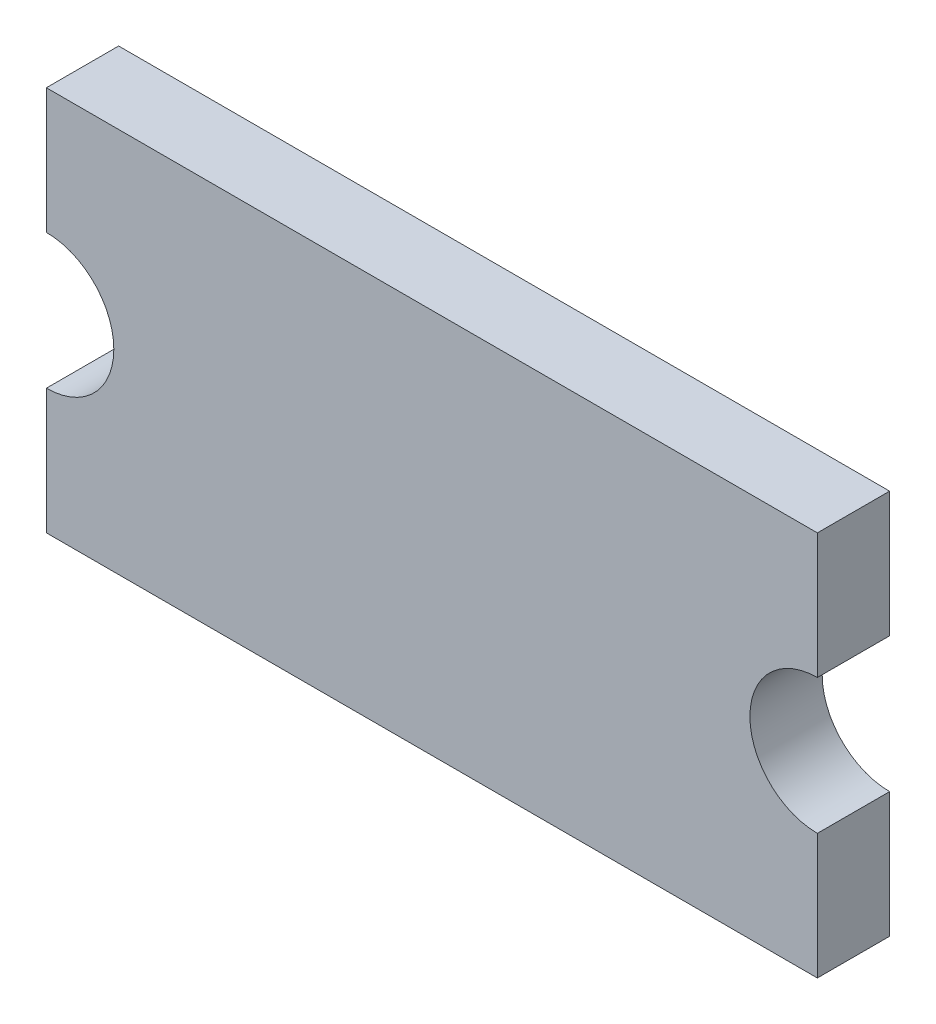
ISO-10303-21;
HEADER;
FILE_DESCRIPTION(('STEP AP214'),'2;1');
FILE_NAME('part.step','',(''),(''),'','','');
FILE_SCHEMA(('AUTOMOTIVE_DESIGN { 1 0 10303 214 1 1 1 1 }'));
ENDSEC;
DATA;
#1=APPLICATION_CONTEXT('core data for automotive mechanical design processes');
#2=APPLICATION_PROTOCOL_DEFINITION('international standard','automotive_design',2000,#1);
#3=PRODUCT_CONTEXT('',#1,'mechanical');
#4=PRODUCT('Part','Part','',(#3));
#5=PRODUCT_RELATED_PRODUCT_CATEGORY('part','',(#4));
#6=PRODUCT_DEFINITION_FORMATION('','',#4);
#7=PRODUCT_DEFINITION_CONTEXT('part definition',#1,'design');
#8=PRODUCT_DEFINITION('design','',#6,#7);
#9=PRODUCT_DEFINITION_SHAPE('','',#8);
#10=(LENGTH_UNIT() NAMED_UNIT(*) SI_UNIT(.MILLI.,.METRE.));
#11=(NAMED_UNIT(*) PLANE_ANGLE_UNIT() SI_UNIT($,.RADIAN.));
#12=(NAMED_UNIT(*) SI_UNIT($,.STERADIAN.) SOLID_ANGLE_UNIT());
#13=UNCERTAINTY_MEASURE_WITH_UNIT(LENGTH_MEASURE(1.E-05),#10,'distance_accuracy_value','');
#14=(GEOMETRIC_REPRESENTATION_CONTEXT(3) GLOBAL_UNCERTAINTY_ASSIGNED_CONTEXT((#13)) GLOBAL_UNIT_ASSIGNED_CONTEXT((#10,
#11,#12)) REPRESENTATION_CONTEXT('',''));
#15=CARTESIAN_POINT('',(0.,0.,0.));
#16=DIRECTION('',(0.,0.,1.));
#17=DIRECTION('',(1.,0.,0.));
#18=AXIS2_PLACEMENT_3D('',#15,#16,#17);
#19=CARTESIAN_POINT('',(0.,0.,0.015));
#20=DIRECTION('',(0.,0.,1.));
#21=DIRECTION('',(1.,0.,0.));
#22=AXIS2_PLACEMENT_3D('',#19,#20,#21);
#23=PLANE('',#22);
#24=DIRECTION('',(1.,0.,0.));
#25=VECTOR('',#24,1.);
#26=CARTESIAN_POINT('',(-0.4,-0.4,0.015));
#27=LINE('',#26,#25);
#28=CARTESIAN_POINT('',(-0.8,-0.4,0.015));
#29=VERTEX_POINT('',#28);
#30=CARTESIAN_POINT('',(0.8,-0.4,0.015));
#31=VERTEX_POINT('',#30);
#32=EDGE_CURVE('E27',#29,#31,#27,.T.);
#33=ORIENTED_EDGE('',*,*,#32,.F.);
#34=DIRECTION('',(0.,-1.,0.));
#35=VECTOR('',#34,1.);
#36=CARTESIAN_POINT('',(-0.8,-0.07,0.015));
#37=LINE('',#36,#35);
#38=CARTESIAN_POINT('',(-0.8,-0.14,0.015));
#39=VERTEX_POINT('',#38);
#40=EDGE_CURVE('E226',#39,#29,#37,.T.);
#41=ORIENTED_EDGE('',*,*,#40,.F.);
#42=CARTESIAN_POINT('',(-0.8,0.,0.015));
#43=DIRECTION('',(0.,0.,-1.));
#44=DIRECTION('',(0.,1.,0.));
#45=AXIS2_PLACEMENT_3D('',#42,#43,#44);
#46=CIRCLE('',#45,0.14);
#47=CARTESIAN_POINT('',(-0.8,0.14,0.015));
#48=VERTEX_POINT('',#47);
#49=EDGE_CURVE('E177',#48,#39,#46,.T.);
#50=ORIENTED_EDGE('',*,*,#49,.F.);
#51=DIRECTION('',(0.,-1.,0.));
#52=VECTOR('',#51,1.);
#53=CARTESIAN_POINT('',(-0.8,0.2,0.015));
#54=LINE('',#53,#52);
#55=CARTESIAN_POINT('',(-0.8,0.4,0.015));
#56=VERTEX_POINT('',#55);
#57=EDGE_CURVE('E165',#56,#48,#54,.T.);
#58=ORIENTED_EDGE('',*,*,#57,.F.);
#59=DIRECTION('',(-1.,0.,0.));
#60=VECTOR('',#59,1.);
#61=CARTESIAN_POINT('',(0.4,0.4,0.015));
#62=LINE('',#61,#60);
#63=CARTESIAN_POINT('',(0.8,0.4,0.015));
#64=VERTEX_POINT('',#63);
#65=EDGE_CURVE('E145',#64,#56,#62,.T.);
#66=ORIENTED_EDGE('',*,*,#65,.F.);
#67=DIRECTION('',(0.,1.,0.));
#68=VECTOR('',#67,1.);
#69=CARTESIAN_POINT('',(0.8,0.07,0.015));
#70=LINE('',#69,#68);
#71=CARTESIAN_POINT('',(0.8,0.14,0.015));
#72=VERTEX_POINT('',#71);
#73=EDGE_CURVE('E126',#72,#64,#70,.T.);
#74=ORIENTED_EDGE('',*,*,#73,.F.);
#75=CARTESIAN_POINT('',(0.8,0.,0.015));
#76=DIRECTION('',(0.,0.,-1.));
#77=DIRECTION('',(0.107142857026025,-0.994243636232237,0.));
#78=AXIS2_PLACEMENT_3D('',#75,#76,#77);
#79=CIRCLE('',#78,0.14);
#80=CARTESIAN_POINT('',(0.8,-0.14,0.015));
#81=VERTEX_POINT('',#80);
#82=EDGE_CURVE('E99',#81,#72,#79,.T.);
#83=ORIENTED_EDGE('',*,*,#82,.F.);
#84=DIRECTION('',(0.,1.,0.));
#85=VECTOR('',#84,1.);
#86=CARTESIAN_POINT('',(0.8,-0.2,0.015));
#87=LINE('',#86,#85);
#88=EDGE_CURVE('E76',#31,#81,#87,.T.);
#89=ORIENTED_EDGE('',*,*,#88,.F.);
#90=EDGE_LOOP('',(#33,#41,#50,#58,#66,#74,#83,#89));
#91=FACE_BOUND('',#90,.T.);
#92=ADVANCED_FACE('F17',(#91),#23,.F.);
#93=CARTESIAN_POINT('',(0.,0.,0.165));
#94=DIRECTION('',(0.,0.,1.));
#95=DIRECTION('',(1.,0.,0.));
#96=AXIS2_PLACEMENT_3D('',#93,#94,#95);
#97=PLANE('',#96);
#98=DIRECTION('',(1.,0.,0.));
#99=VECTOR('',#98,1.);
#100=CARTESIAN_POINT('',(-0.785000000016,-0.4,0.165));
#101=LINE('',#100,#99);
#102=CARTESIAN_POINT('',(-0.8,-0.4,0.165));
#103=VERTEX_POINT('',#102);
#104=CARTESIAN_POINT('',(0.8,-0.4,0.165));
#105=VERTEX_POINT('',#104);
#106=EDGE_CURVE('E11',#103,#105,#101,.T.);
#107=ORIENTED_EDGE('',*,*,#106,.T.);
#108=DIRECTION('',(0.,1.,0.));
#109=VECTOR('',#108,1.);
#110=CARTESIAN_POINT('',(0.8,-0.4,0.165));
#111=LINE('',#110,#109);
#112=CARTESIAN_POINT('',(0.8,-0.14,0.165));
#113=VERTEX_POINT('',#112);
#114=EDGE_CURVE('E81',#105,#113,#111,.T.);
#115=ORIENTED_EDGE('',*,*,#114,.T.);
#116=CARTESIAN_POINT('',(0.8,0.,0.165));
#117=DIRECTION('',(0.,0.,-1.));
#118=DIRECTION('',(0.107142857026025,-0.994243636232237,0.));
#119=AXIS2_PLACEMENT_3D('',#116,#117,#118);
#120=CIRCLE('',#119,0.14);
#121=CARTESIAN_POINT('',(0.8,0.14,0.165));
#122=VERTEX_POINT('',#121);
#123=EDGE_CURVE('E84',#113,#122,#120,.T.);
#124=ORIENTED_EDGE('',*,*,#123,.T.);
#125=DIRECTION('',(0.,1.,0.));
#126=VECTOR('',#125,1.);
#127=CARTESIAN_POINT('',(0.8,0.14,0.165));
#128=LINE('',#127,#126);
#129=CARTESIAN_POINT('',(0.8,0.4,0.165));
#130=VERTEX_POINT('',#129);
#131=EDGE_CURVE('E131',#122,#130,#128,.T.);
#132=ORIENTED_EDGE('',*,*,#131,.T.);
#133=DIRECTION('',(-1.,0.,0.));
#134=VECTOR('',#133,1.);
#135=CARTESIAN_POINT('',(0.785000000016,0.4,0.165));
#136=LINE('',#135,#134);
#137=CARTESIAN_POINT('',(-0.8,0.4,0.165));
#138=VERTEX_POINT('',#137);
#139=EDGE_CURVE('E149',#130,#138,#136,.T.);
#140=ORIENTED_EDGE('',*,*,#139,.T.);
#141=DIRECTION('',(0.,-1.,0.));
#142=VECTOR('',#141,1.);
#143=CARTESIAN_POINT('',(-0.8,0.4,0.165));
#144=LINE('',#143,#142);
#145=CARTESIAN_POINT('',(-0.8,0.14,0.165));
#146=VERTEX_POINT('',#145);
#147=EDGE_CURVE('E139',#138,#146,#144,.T.);
#148=ORIENTED_EDGE('',*,*,#147,.T.);
#149=CARTESIAN_POINT('',(-0.8,0.,0.165));
#150=DIRECTION('',(0.,0.,-1.));
#151=DIRECTION('',(0.,1.,0.));
#152=AXIS2_PLACEMENT_3D('',#149,#150,#151);
#153=CIRCLE('',#152,0.14);
#154=CARTESIAN_POINT('',(-0.8,-0.14,0.165));
#155=VERTEX_POINT('',#154);
#156=EDGE_CURVE('E181',#146,#155,#153,.T.);
#157=ORIENTED_EDGE('',*,*,#156,.T.);
#158=DIRECTION('',(0.,-1.,0.));
#159=VECTOR('',#158,1.);
#160=CARTESIAN_POINT('',(-0.8,-0.14,0.165));
#161=LINE('',#160,#159);
#162=EDGE_CURVE('E170',#155,#103,#161,.T.);
#163=ORIENTED_EDGE('',*,*,#162,.T.);
#164=EDGE_LOOP('',(#107,#115,#124,#132,#140,#148,#157,#163));
#165=FACE_BOUND('',#164,.T.);
#166=ADVANCED_FACE('F82',(#165),#97,.T.);
#167=CARTESIAN_POINT('',(-0.8,-0.4,0.));
#168=DIRECTION('',(0.,-1.,0.));
#169=DIRECTION('',(0.,0.,-1.));
#170=AXIS2_PLACEMENT_3D('',#167,#168,#169);
#171=PLANE('',#170);
#172=ORIENTED_EDGE('',*,*,#32,.T.);
#173=DIRECTION('',(0.,0.,1.));
#174=VECTOR('',#173,1.);
#175=CARTESIAN_POINT('',(0.8,-0.4,0.));
#176=LINE('',#175,#174);
#177=EDGE_CURVE('E87',#31,#105,#176,.T.);
#178=ORIENTED_EDGE('',*,*,#177,.T.);
#179=ORIENTED_EDGE('',*,*,#106,.F.);
#180=DIRECTION('',(0.,0.,1.));
#181=VECTOR('',#180,1.);
#182=CARTESIAN_POINT('',(-0.8,-0.4,0.));
#183=LINE('',#182,#181);
#184=EDGE_CURVE('E120',#29,#103,#183,.T.);
#185=ORIENTED_EDGE('',*,*,#184,.F.);
#186=EDGE_LOOP('',(#172,#178,#179,#185));
#187=FACE_BOUND('',#186,.T.);
#188=ADVANCED_FACE('F117',(#187),#171,.T.);
#189=CARTESIAN_POINT('',(0.8,-0.4,0.));
#190=DIRECTION('',(1.,0.,0.));
#191=DIRECTION('',(0.,1.,0.));
#192=AXIS2_PLACEMENT_3D('',#189,#190,#191);
#193=PLANE('',#192);
#194=ORIENTED_EDGE('',*,*,#88,.T.);
#195=DIRECTION('',(0.,0.,1.));
#196=VECTOR('',#195,1.);
#197=CARTESIAN_POINT('',(0.8,-0.14,0.));
#198=LINE('',#197,#196);
#199=EDGE_CURVE('E89',#81,#113,#198,.T.);
#200=ORIENTED_EDGE('',*,*,#199,.T.);
#201=ORIENTED_EDGE('',*,*,#114,.F.);
#202=ORIENTED_EDGE('',*,*,#177,.F.);
#203=EDGE_LOOP('',(#194,#200,#201,#202));
#204=FACE_BOUND('',#203,.T.);
#205=ADVANCED_FACE('F19',(#204),#193,.T.);
#206=CARTESIAN_POINT('',(0.8,0.,0.));
#207=DIRECTION('',(0.,0.,1.));
#208=DIRECTION('',(-1.,0.,0.));
#209=AXIS2_PLACEMENT_3D('',#206,#207,#208);
#210=CYLINDRICAL_SURFACE('',#209,0.14);
#211=ORIENTED_EDGE('',*,*,#82,.T.);
#212=DIRECTION('',(0.,0.,1.));
#213=VECTOR('',#212,1.);
#214=CARTESIAN_POINT('',(0.8,0.14,0.));
#215=LINE('',#214,#213);
#216=EDGE_CURVE('E96',#72,#122,#215,.T.);
#217=ORIENTED_EDGE('',*,*,#216,.T.);
#218=ORIENTED_EDGE('',*,*,#123,.F.);
#219=ORIENTED_EDGE('',*,*,#199,.F.);
#220=EDGE_LOOP('',(#211,#217,#218,#219));
#221=FACE_BOUND('',#220,.T.);
#222=ADVANCED_FACE('F94',(#221),#210,.F.);
#223=CARTESIAN_POINT('',(0.8,0.14,0.));
#224=DIRECTION('',(1.,0.,0.));
#225=DIRECTION('',(0.,1.,0.));
#226=AXIS2_PLACEMENT_3D('',#223,#224,#225);
#227=PLANE('',#226);
#228=ORIENTED_EDGE('',*,*,#73,.T.);
#229=DIRECTION('',(0.,0.,1.));
#230=VECTOR('',#229,1.);
#231=CARTESIAN_POINT('',(0.8,0.4,0.));
#232=LINE('',#231,#230);
#233=EDGE_CURVE('E152',#64,#130,#232,.T.);
#234=ORIENTED_EDGE('',*,*,#233,.T.);
#235=ORIENTED_EDGE('',*,*,#131,.F.);
#236=ORIENTED_EDGE('',*,*,#216,.F.);
#237=EDGE_LOOP('',(#228,#234,#235,#236));
#238=FACE_BOUND('',#237,.T.);
#239=ADVANCED_FACE('F128',(#238),#227,.T.);
#240=CARTESIAN_POINT('',(0.8,0.4,0.));
#241=DIRECTION('',(0.,1.,0.));
#242=DIRECTION('',(1.,0.,0.));
#243=AXIS2_PLACEMENT_3D('',#240,#241,#242);
#244=PLANE('',#243);
#245=ORIENTED_EDGE('',*,*,#65,.T.);
#246=DIRECTION('',(0.,0.,1.));
#247=VECTOR('',#246,1.);
#248=CARTESIAN_POINT('',(-0.8,0.4,0.));
#249=LINE('',#248,#247);
#250=EDGE_CURVE('E141',#56,#138,#249,.T.);
#251=ORIENTED_EDGE('',*,*,#250,.T.);
#252=ORIENTED_EDGE('',*,*,#139,.F.);
#253=ORIENTED_EDGE('',*,*,#233,.F.);
#254=EDGE_LOOP('',(#245,#251,#252,#253));
#255=FACE_BOUND('',#254,.T.);
#256=ADVANCED_FACE('F306',(#255),#244,.T.);
#257=CARTESIAN_POINT('',(-0.8,0.4,0.));
#258=DIRECTION('',(-1.,0.,0.));
#259=DIRECTION('',(0.,0.,1.));
#260=AXIS2_PLACEMENT_3D('',#257,#258,#259);
#261=PLANE('',#260);
#262=ORIENTED_EDGE('',*,*,#57,.T.);
#263=DIRECTION('',(0.,0.,1.));
#264=VECTOR('',#263,1.);
#265=CARTESIAN_POINT('',(-0.8,0.14,0.));
#266=LINE('',#265,#264);
#267=EDGE_CURVE('E169',#48,#146,#266,.T.);
#268=ORIENTED_EDGE('',*,*,#267,.T.);
#269=ORIENTED_EDGE('',*,*,#147,.F.);
#270=ORIENTED_EDGE('',*,*,#250,.F.);
#271=EDGE_LOOP('',(#262,#268,#269,#270));
#272=FACE_BOUND('',#271,.T.);
#273=ADVANCED_FACE('F192',(#272),#261,.T.);
#274=CARTESIAN_POINT('',(-0.8,0.,0.));
#275=DIRECTION('',(0.,0.,1.));
#276=DIRECTION('',(0.,1.,0.));
#277=AXIS2_PLACEMENT_3D('',#274,#275,#276);
#278=CYLINDRICAL_SURFACE('',#277,0.14);
#279=ORIENTED_EDGE('',*,*,#49,.T.);
#280=DIRECTION('',(0.,0.,1.));
#281=VECTOR('',#280,1.);
#282=CARTESIAN_POINT('',(-0.8,-0.14,0.));
#283=LINE('',#282,#281);
#284=EDGE_CURVE('E173',#39,#155,#283,.T.);
#285=ORIENTED_EDGE('',*,*,#284,.T.);
#286=ORIENTED_EDGE('',*,*,#156,.F.);
#287=ORIENTED_EDGE('',*,*,#267,.F.);
#288=EDGE_LOOP('',(#279,#285,#286,#287));
#289=FACE_BOUND('',#288,.T.);
#290=ADVANCED_FACE('F197',(#289),#278,.F.);
#291=CARTESIAN_POINT('',(-0.8,-0.14,0.));
#292=DIRECTION('',(-1.,0.,0.));
#293=DIRECTION('',(0.,0.,1.));
#294=AXIS2_PLACEMENT_3D('',#291,#292,#293);
#295=PLANE('',#294);
#296=ORIENTED_EDGE('',*,*,#40,.T.);
#297=ORIENTED_EDGE('',*,*,#184,.T.);
#298=ORIENTED_EDGE('',*,*,#162,.F.);
#299=ORIENTED_EDGE('',*,*,#284,.F.);
#300=EDGE_LOOP('',(#296,#297,#298,#299));
#301=FACE_BOUND('',#300,.T.);
#302=ADVANCED_FACE('F225',(#301),#295,.T.);
#303=CLOSED_SHELL('',(#92,#166,#188,#205,#222,#239,#256,#273,#290,#302));
#304=MANIFOLD_SOLID_BREP('B1',#303);
#305=ADVANCED_BREP_SHAPE_REPRESENTATION('',(#18,#304),#14);
#306=SHAPE_DEFINITION_REPRESENTATION(#9,#305);
ENDSEC;
END-ISO-10303-21;
